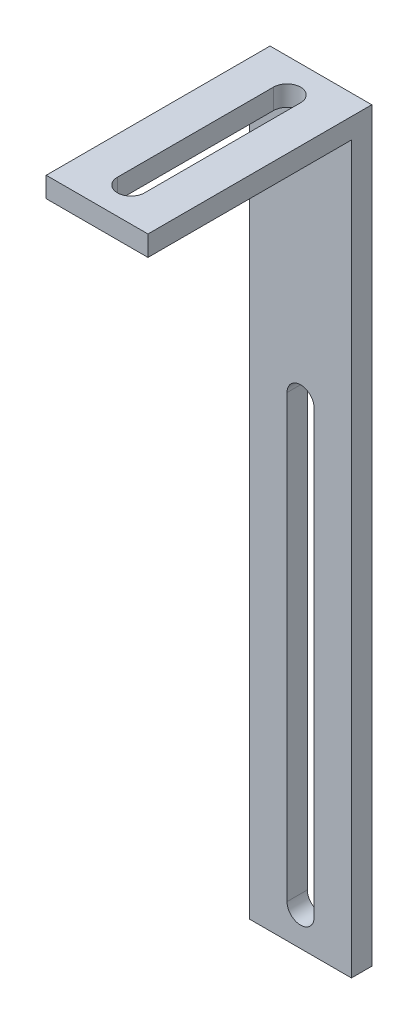
ISO-10303-21;
HEADER;
FILE_DESCRIPTION(('STEP AP214'),'2;1');
FILE_NAME('part.step','',(''),(''),'','','');
FILE_SCHEMA(('AUTOMOTIVE_DESIGN { 1 0 10303 214 1 1 1 1 }'));
ENDSEC;
DATA;
#1=APPLICATION_CONTEXT('core data for automotive mechanical design processes');
#2=APPLICATION_PROTOCOL_DEFINITION('international standard','automotive_design',2000,#1);
#3=PRODUCT_CONTEXT('',#1,'mechanical');
#4=PRODUCT('Part','Part','',(#3));
#5=PRODUCT_RELATED_PRODUCT_CATEGORY('part','',(#4));
#6=PRODUCT_DEFINITION_FORMATION('','',#4);
#7=PRODUCT_DEFINITION_CONTEXT('part definition',#1,'design');
#8=PRODUCT_DEFINITION('design','',#6,#7);
#9=PRODUCT_DEFINITION_SHAPE('','',#8);
#10=(LENGTH_UNIT() NAMED_UNIT(*) SI_UNIT(.MILLI.,.METRE.));
#11=(NAMED_UNIT(*) PLANE_ANGLE_UNIT() SI_UNIT($,.RADIAN.));
#12=(NAMED_UNIT(*) SI_UNIT($,.STERADIAN.) SOLID_ANGLE_UNIT());
#13=UNCERTAINTY_MEASURE_WITH_UNIT(LENGTH_MEASURE(1.E-05),#10,'distance_accuracy_value','');
#14=(GEOMETRIC_REPRESENTATION_CONTEXT(3) GLOBAL_UNCERTAINTY_ASSIGNED_CONTEXT((#13)) GLOBAL_UNIT_ASSIGNED_CONTEXT((#10,
#11,#12)) REPRESENTATION_CONTEXT('',''));
#15=CARTESIAN_POINT('',(0.,0.,0.));
#16=DIRECTION('',(0.,0.,1.));
#17=DIRECTION('',(1.,0.,0.));
#18=AXIS2_PLACEMENT_3D('',#15,#16,#17);
#19=CARTESIAN_POINT('',(7.49999999999999,55.,3.));
#20=DIRECTION('',(-1.,0.,0.));
#21=DIRECTION('',(0.,-1.,0.));
#22=AXIS2_PLACEMENT_3D('',#19,#20,#21);
#23=PLANE('',#22);
#24=DIRECTION('',(0.,1.,0.));
#25=VECTOR('',#24,1.);
#26=CARTESIAN_POINT('',(7.49999999999999,55.,0.));
#27=LINE('',#26,#25);
#28=CARTESIAN_POINT('',(7.50000000000001,-55.,0.));
#29=VERTEX_POINT('',#28);
#30=CARTESIAN_POINT('',(7.49999999999999,55.,0.));
#31=VERTEX_POINT('',#30);
#32=EDGE_CURVE('E212',#29,#31,#27,.T.);
#33=ORIENTED_EDGE('',*,*,#32,.T.);
#34=DIRECTION('',(0.,0.,-1.));
#35=VECTOR('',#34,1.);
#36=CARTESIAN_POINT('',(7.49999999999999,55.,3.));
#37=LINE('',#36,#35);
#38=CARTESIAN_POINT('',(7.50000000000001,55.,33.));
#39=VERTEX_POINT('',#38);
#40=EDGE_CURVE('E243',#39,#31,#37,.T.);
#41=ORIENTED_EDGE('',*,*,#40,.F.);
#42=DIRECTION('',(0.,1.,0.));
#43=VECTOR('',#42,1.);
#44=CARTESIAN_POINT('',(7.50000000000001,55.,33.));
#45=LINE('',#44,#43);
#46=CARTESIAN_POINT('',(7.50000000000001,52.,33.));
#47=VERTEX_POINT('',#46);
#48=EDGE_CURVE('E172',#47,#39,#45,.T.);
#49=ORIENTED_EDGE('',*,*,#48,.F.);
#50=DIRECTION('',(0.,0.,-1.));
#51=VECTOR('',#50,1.);
#52=CARTESIAN_POINT('',(7.50000000000001,52.,33.));
#53=LINE('',#52,#51);
#54=CARTESIAN_POINT('',(7.50000000000001,52.,3.));
#55=VERTEX_POINT('',#54);
#56=EDGE_CURVE('E178',#47,#55,#53,.T.);
#57=ORIENTED_EDGE('',*,*,#56,.T.);
#58=DIRECTION('',(0.,1.,0.));
#59=VECTOR('',#58,1.);
#60=CARTESIAN_POINT('',(7.49999999999999,55.,3.));
#61=LINE('',#60,#59);
#62=CARTESIAN_POINT('',(7.50000000000001,-55.,3.));
#63=VERTEX_POINT('',#62);
#64=EDGE_CURVE('E219',#63,#55,#61,.T.);
#65=ORIENTED_EDGE('',*,*,#64,.F.);
#66=DIRECTION('',(0.,0.,-1.));
#67=VECTOR('',#66,1.);
#68=CARTESIAN_POINT('',(7.50000000000001,-55.,3.));
#69=LINE('',#68,#67);
#70=EDGE_CURVE('E227',#63,#29,#69,.T.);
#71=ORIENTED_EDGE('',*,*,#70,.T.);
#72=EDGE_LOOP('',(#33,#41,#49,#57,#65,#71));
#73=FACE_BOUND('',#72,.T.);
#74=ADVANCED_FACE('F34',(#73),#23,.F.);
#75=CARTESIAN_POINT('',(-7.50000000000001,55.,3.));
#76=DIRECTION('',(0.,-1.,0.));
#77=DIRECTION('',(0.,0.,-1.));
#78=AXIS2_PLACEMENT_3D('',#75,#76,#77);
#79=PLANE('',#78);
#80=DIRECTION('',(0.,0.,1.));
#81=VECTOR('',#80,1.);
#82=CARTESIAN_POINT('',(-2.00000000000001,55.,5.));
#83=LINE('',#82,#81);
#84=CARTESIAN_POINT('',(-2.00000000000001,55.,5.));
#85=VERTEX_POINT('',#84);
#86=CARTESIAN_POINT('',(-2.,55.,28.));
#87=VERTEX_POINT('',#86);
#88=EDGE_CURVE('E149',#85,#87,#83,.T.);
#89=ORIENTED_EDGE('',*,*,#88,.F.);
#90=CARTESIAN_POINT('',(0.,55.,5.));
#91=DIRECTION('',(0.,1.,0.));
#92=DIRECTION('',(0.,0.,1.));
#93=AXIS2_PLACEMENT_3D('',#90,#91,#92);
#94=CIRCLE('',#93,2.);
#95=CARTESIAN_POINT('',(1.99999999999999,55.,5.));
#96=VERTEX_POINT('',#95);
#97=EDGE_CURVE('E48',#96,#85,#94,.T.);
#98=ORIENTED_EDGE('',*,*,#97,.F.);
#99=DIRECTION('',(0.,0.,-1.));
#100=VECTOR('',#99,1.);
#101=CARTESIAN_POINT('',(1.99999999999999,55.,5.));
#102=LINE('',#101,#100);
#103=CARTESIAN_POINT('',(2.,55.,28.));
#104=VERTEX_POINT('',#103);
#105=EDGE_CURVE('E156',#104,#96,#102,.T.);
#106=ORIENTED_EDGE('',*,*,#105,.F.);
#107=CARTESIAN_POINT('',(0.,55.,28.));
#108=DIRECTION('',(0.,1.,0.));
#109=DIRECTION('',(0.,0.,1.));
#110=AXIS2_PLACEMENT_3D('',#107,#108,#109);
#111=CIRCLE('',#110,2.);
#112=EDGE_CURVE('E140',#87,#104,#111,.T.);
#113=ORIENTED_EDGE('',*,*,#112,.F.);
#114=EDGE_LOOP('',(#89,#98,#106,#113));
#115=FACE_BOUND('',#114,.T.);
#116=DIRECTION('',(-1.,0.,0.));
#117=VECTOR('',#116,1.);
#118=CARTESIAN_POINT('',(-7.50000000000001,55.,0.));
#119=LINE('',#118,#117);
#120=CARTESIAN_POINT('',(-7.50000000000001,55.,0.));
#121=VERTEX_POINT('',#120);
#122=EDGE_CURVE('E230',#31,#121,#119,.T.);
#123=ORIENTED_EDGE('',*,*,#122,.T.);
#124=DIRECTION('',(0.,0.,-1.));
#125=VECTOR('',#124,1.);
#126=CARTESIAN_POINT('',(-7.50000000000001,55.,3.));
#127=LINE('',#126,#125);
#128=CARTESIAN_POINT('',(-7.50000000000001,55.,33.));
#129=VERTEX_POINT('',#128);
#130=EDGE_CURVE('E240',#129,#121,#127,.T.);
#131=ORIENTED_EDGE('',*,*,#130,.F.);
#132=DIRECTION('',(-1.,0.,0.));
#133=VECTOR('',#132,1.);
#134=CARTESIAN_POINT('',(-7.50000000000001,55.,33.));
#135=LINE('',#134,#133);
#136=EDGE_CURVE('E175',#39,#129,#135,.T.);
#137=ORIENTED_EDGE('',*,*,#136,.F.);
#138=ORIENTED_EDGE('',*,*,#40,.T.);
#139=EDGE_LOOP('',(#123,#131,#137,#138));
#140=FACE_BOUND('',#139,.T.);
#141=ADVANCED_FACE('F153',(#115,#140),#79,.F.);
#142=CARTESIAN_POINT('',(-7.50000000000001,55.,3.));
#143=DIRECTION('',(1.,0.,0.));
#144=DIRECTION('',(0.,1.,0.));
#145=AXIS2_PLACEMENT_3D('',#142,#143,#144);
#146=PLANE('',#145);
#147=DIRECTION('',(0.,-1.,0.));
#148=VECTOR('',#147,1.);
#149=CARTESIAN_POINT('',(-7.50000000000001,55.,0.));
#150=LINE('',#149,#148);
#151=CARTESIAN_POINT('',(-7.49999999999999,-55.,0.));
#152=VERTEX_POINT('',#151);
#153=EDGE_CURVE('E232',#121,#152,#150,.T.);
#154=ORIENTED_EDGE('',*,*,#153,.T.);
#155=DIRECTION('',(0.,0.,-1.));
#156=VECTOR('',#155,1.);
#157=CARTESIAN_POINT('',(-7.49999999999999,-55.,3.));
#158=LINE('',#157,#156);
#159=CARTESIAN_POINT('',(-7.49999999999999,-55.,3.));
#160=VERTEX_POINT('',#159);
#161=EDGE_CURVE('E237',#160,#152,#158,.T.);
#162=ORIENTED_EDGE('',*,*,#161,.F.);
#163=DIRECTION('',(0.,-1.,0.));
#164=VECTOR('',#163,1.);
#165=CARTESIAN_POINT('',(-7.50000000000001,55.,3.));
#166=LINE('',#165,#164);
#167=CARTESIAN_POINT('',(-7.50000000000001,52.,3.));
#168=VERTEX_POINT('',#167);
#169=EDGE_CURVE('E222',#168,#160,#166,.T.);
#170=ORIENTED_EDGE('',*,*,#169,.F.);
#171=DIRECTION('',(0.,0.,-1.));
#172=VECTOR('',#171,1.);
#173=CARTESIAN_POINT('',(-7.50000000000001,52.,33.));
#174=LINE('',#173,#172);
#175=CARTESIAN_POINT('',(-7.50000000000001,52.,33.));
#176=VERTEX_POINT('',#175);
#177=EDGE_CURVE('E183',#176,#168,#174,.T.);
#178=ORIENTED_EDGE('',*,*,#177,.F.);
#179=DIRECTION('',(0.,-1.,0.));
#180=VECTOR('',#179,1.);
#181=CARTESIAN_POINT('',(-7.50000000000001,55.,33.));
#182=LINE('',#181,#180);
#183=EDGE_CURVE('E166',#129,#176,#182,.T.);
#184=ORIENTED_EDGE('',*,*,#183,.F.);
#185=ORIENTED_EDGE('',*,*,#130,.T.);
#186=EDGE_LOOP('',(#154,#162,#170,#178,#184,#185));
#187=FACE_BOUND('',#186,.T.);
#188=ADVANCED_FACE('F272',(#187),#146,.F.);
#189=CARTESIAN_POINT('',(-7.49999999999999,-55.,3.));
#190=DIRECTION('',(0.,1.,0.));
#191=DIRECTION('',(0.,0.,1.));
#192=AXIS2_PLACEMENT_3D('',#189,#190,#191);
#193=PLANE('',#192);
#194=DIRECTION('',(1.,0.,0.));
#195=VECTOR('',#194,1.);
#196=CARTESIAN_POINT('',(-7.49999999999999,-55.,0.));
#197=LINE('',#196,#195);
#198=EDGE_CURVE('E223',#152,#29,#197,.T.);
#199=ORIENTED_EDGE('',*,*,#198,.T.);
#200=ORIENTED_EDGE('',*,*,#70,.F.);
#201=DIRECTION('',(1.,0.,0.));
#202=VECTOR('',#201,1.);
#203=CARTESIAN_POINT('',(-7.49999999999999,-55.,3.));
#204=LINE('',#203,#202);
#205=EDGE_CURVE('E225',#160,#63,#204,.T.);
#206=ORIENTED_EDGE('',*,*,#205,.F.);
#207=ORIENTED_EDGE('',*,*,#161,.T.);
#208=EDGE_LOOP('',(#199,#200,#206,#207));
#209=FACE_BOUND('',#208,.T.);
#210=ADVANCED_FACE('F277',(#209),#193,.F.);
#211=CARTESIAN_POINT('',(0.,0.,3.));
#212=DIRECTION('',(0.,0.,1.));
#213=DIRECTION('',(1.,0.,0.));
#214=AXIS2_PLACEMENT_3D('',#211,#212,#213);
#215=PLANE('',#214);
#216=DIRECTION('',(1.,0.,0.));
#217=VECTOR('',#216,1.);
#218=CARTESIAN_POINT('',(-7.50000000000001,52.,3.));
#219=LINE('',#218,#217);
#220=CARTESIAN_POINT('',(0.,52.,3.));
#221=VERTEX_POINT('',#220);
#222=EDGE_CURVE('E163',#221,#55,#219,.T.);
#223=ORIENTED_EDGE('',*,*,#222,.F.);
#224=EDGE_CURVE('E170',#168,#221,#219,.T.);
#225=ORIENTED_EDGE('',*,*,#224,.F.);
#226=ORIENTED_EDGE('',*,*,#169,.T.);
#227=ORIENTED_EDGE('',*,*,#205,.T.);
#228=ORIENTED_EDGE('',*,*,#64,.T.);
#229=EDGE_LOOP('',(#223,#225,#226,#227,#228));
#230=FACE_BOUND('',#229,.T.);
#231=CARTESIAN_POINT('',(0.,15.,3.));
#232=DIRECTION('',(0.,0.,1.));
#233=DIRECTION('',(1.,0.,0.));
#234=AXIS2_PLACEMENT_3D('',#231,#232,#233);
#235=CIRCLE('',#234,2.);
#236=CARTESIAN_POINT('',(2.,15.,3.));
#237=VERTEX_POINT('',#236);
#238=CARTESIAN_POINT('',(-2.,15.,3.));
#239=VERTEX_POINT('',#238);
#240=EDGE_CURVE('E186',#237,#239,#235,.T.);
#241=ORIENTED_EDGE('',*,*,#240,.F.);
#242=DIRECTION('',(0.,1.,0.));
#243=VECTOR('',#242,1.);
#244=CARTESIAN_POINT('',(2.,15.,3.));
#245=LINE('',#244,#243);
#246=CARTESIAN_POINT('',(2.00000000000001,-50.,3.));
#247=VERTEX_POINT('',#246);
#248=EDGE_CURVE('E191',#247,#237,#245,.T.);
#249=ORIENTED_EDGE('',*,*,#248,.F.);
#250=CARTESIAN_POINT('',(0.,-50.,3.));
#251=DIRECTION('',(0.,0.,1.));
#252=DIRECTION('',(1.,0.,0.));
#253=AXIS2_PLACEMENT_3D('',#250,#251,#252);
#254=CIRCLE('',#253,2.);
#255=CARTESIAN_POINT('',(-1.99999999999999,-50.,3.));
#256=VERTEX_POINT('',#255);
#257=EDGE_CURVE('E205',#256,#247,#254,.T.);
#258=ORIENTED_EDGE('',*,*,#257,.F.);
#259=DIRECTION('',(0.,-1.,0.));
#260=VECTOR('',#259,1.);
#261=CARTESIAN_POINT('',(-2.,15.,3.));
#262=LINE('',#261,#260);
#263=EDGE_CURVE('E202',#239,#256,#262,.T.);
#264=ORIENTED_EDGE('',*,*,#263,.F.);
#265=EDGE_LOOP('',(#241,#249,#258,#264));
#266=FACE_BOUND('',#265,.T.);
#267=ADVANCED_FACE('F258',(#230,#266),#215,.T.);
#268=CARTESIAN_POINT('',(0.,0.,0.));
#269=DIRECTION('',(0.,0.,1.));
#270=DIRECTION('',(1.,0.,0.));
#271=AXIS2_PLACEMENT_3D('',#268,#269,#270);
#272=PLANE('',#271);
#273=DIRECTION('',(0.,1.,0.));
#274=VECTOR('',#273,1.);
#275=CARTESIAN_POINT('',(2.,15.,0.));
#276=LINE('',#275,#274);
#277=CARTESIAN_POINT('',(2.00000000000001,-50.,0.));
#278=VERTEX_POINT('',#277);
#279=CARTESIAN_POINT('',(2.,15.,0.));
#280=VERTEX_POINT('',#279);
#281=EDGE_CURVE('E197',#278,#280,#276,.T.);
#282=ORIENTED_EDGE('',*,*,#281,.T.);
#283=CARTESIAN_POINT('',(0.,15.,0.));
#284=DIRECTION('',(0.,0.,1.));
#285=DIRECTION('',(1.,0.,0.));
#286=AXIS2_PLACEMENT_3D('',#283,#284,#285);
#287=CIRCLE('',#286,2.);
#288=CARTESIAN_POINT('',(-2.,15.,0.));
#289=VERTEX_POINT('',#288);
#290=EDGE_CURVE('E187',#280,#289,#287,.T.);
#291=ORIENTED_EDGE('',*,*,#290,.T.);
#292=DIRECTION('',(0.,-1.,0.));
#293=VECTOR('',#292,1.);
#294=CARTESIAN_POINT('',(-2.,15.,0.));
#295=LINE('',#294,#293);
#296=CARTESIAN_POINT('',(-1.99999999999999,-50.,0.));
#297=VERTEX_POINT('',#296);
#298=EDGE_CURVE('E190',#289,#297,#295,.T.);
#299=ORIENTED_EDGE('',*,*,#298,.T.);
#300=CARTESIAN_POINT('',(0.,-50.,0.));
#301=DIRECTION('',(0.,0.,1.));
#302=DIRECTION('',(1.,0.,0.));
#303=AXIS2_PLACEMENT_3D('',#300,#301,#302);
#304=CIRCLE('',#303,2.);
#305=EDGE_CURVE('E194',#297,#278,#304,.T.);
#306=ORIENTED_EDGE('',*,*,#305,.T.);
#307=EDGE_LOOP('',(#282,#291,#299,#306));
#308=FACE_BOUND('',#307,.T.);
#309=ORIENTED_EDGE('',*,*,#32,.F.);
#310=ORIENTED_EDGE('',*,*,#198,.F.);
#311=ORIENTED_EDGE('',*,*,#153,.F.);
#312=ORIENTED_EDGE('',*,*,#122,.F.);
#313=EDGE_LOOP('',(#309,#310,#311,#312));
#314=FACE_BOUND('',#313,.T.);
#315=ADVANCED_FACE('F280',(#308,#314),#272,.F.);
#316=CARTESIAN_POINT('',(0.,15.,0.));
#317=DIRECTION('',(0.,0.,1.));
#318=DIRECTION('',(1.,0.,0.));
#319=AXIS2_PLACEMENT_3D('',#316,#317,#318);
#320=CYLINDRICAL_SURFACE('',#319,2.);
#321=ORIENTED_EDGE('',*,*,#240,.T.);
#322=DIRECTION('',(0.,0.,1.));
#323=VECTOR('',#322,1.);
#324=CARTESIAN_POINT('',(-2.,15.,0.));
#325=LINE('',#324,#323);
#326=EDGE_CURVE('E200',#289,#239,#325,.T.);
#327=ORIENTED_EDGE('',*,*,#326,.F.);
#328=ORIENTED_EDGE('',*,*,#290,.F.);
#329=DIRECTION('',(0.,0.,1.));
#330=VECTOR('',#329,1.);
#331=CARTESIAN_POINT('',(2.,15.,0.));
#332=LINE('',#331,#330);
#333=EDGE_CURVE('E210',#280,#237,#332,.T.);
#334=ORIENTED_EDGE('',*,*,#333,.T.);
#335=EDGE_LOOP('',(#321,#327,#328,#334));
#336=FACE_BOUND('',#335,.T.);
#337=ADVANCED_FACE('F292',(#336),#320,.F.);
#338=CARTESIAN_POINT('',(2.,15.,0.));
#339=DIRECTION('',(1.,0.,0.));
#340=DIRECTION('',(0.,1.,0.));
#341=AXIS2_PLACEMENT_3D('',#338,#339,#340);
#342=PLANE('',#341);
#343=ORIENTED_EDGE('',*,*,#248,.T.);
#344=ORIENTED_EDGE('',*,*,#333,.F.);
#345=ORIENTED_EDGE('',*,*,#281,.F.);
#346=DIRECTION('',(0.,0.,1.));
#347=VECTOR('',#346,1.);
#348=CARTESIAN_POINT('',(2.00000000000001,-50.,0.));
#349=LINE('',#348,#347);
#350=EDGE_CURVE('E213',#278,#247,#349,.T.);
#351=ORIENTED_EDGE('',*,*,#350,.T.);
#352=EDGE_LOOP('',(#343,#344,#345,#351));
#353=FACE_BOUND('',#352,.T.);
#354=ADVANCED_FACE('F298',(#353),#342,.F.);
#355=CARTESIAN_POINT('',(0.,-50.,0.));
#356=DIRECTION('',(0.,0.,1.));
#357=DIRECTION('',(1.,0.,0.));
#358=AXIS2_PLACEMENT_3D('',#355,#356,#357);
#359=CYLINDRICAL_SURFACE('',#358,2.);
#360=ORIENTED_EDGE('',*,*,#257,.T.);
#361=ORIENTED_EDGE('',*,*,#350,.F.);
#362=ORIENTED_EDGE('',*,*,#305,.F.);
#363=DIRECTION('',(0.,0.,1.));
#364=VECTOR('',#363,1.);
#365=CARTESIAN_POINT('',(-1.99999999999999,-50.,0.));
#366=LINE('',#365,#364);
#367=EDGE_CURVE('E215',#297,#256,#366,.T.);
#368=ORIENTED_EDGE('',*,*,#367,.T.);
#369=EDGE_LOOP('',(#360,#361,#362,#368));
#370=FACE_BOUND('',#369,.T.);
#371=ADVANCED_FACE('F303',(#370),#359,.F.);
#372=CARTESIAN_POINT('',(-2.,15.,0.));
#373=DIRECTION('',(-1.,0.,0.));
#374=DIRECTION('',(0.,-1.,0.));
#375=AXIS2_PLACEMENT_3D('',#372,#373,#374);
#376=PLANE('',#375);
#377=ORIENTED_EDGE('',*,*,#263,.T.);
#378=ORIENTED_EDGE('',*,*,#367,.F.);
#379=ORIENTED_EDGE('',*,*,#298,.F.);
#380=ORIENTED_EDGE('',*,*,#326,.T.);
#381=EDGE_LOOP('',(#377,#378,#379,#380));
#382=FACE_BOUND('',#381,.T.);
#383=ADVANCED_FACE('F300',(#382),#376,.F.);
#384=CARTESIAN_POINT('',(-7.50000000000001,52.,33.));
#385=DIRECTION('',(0.,1.,0.));
#386=DIRECTION('',(0.,0.,1.));
#387=AXIS2_PLACEMENT_3D('',#384,#385,#386);
#388=PLANE('',#387);
#389=DIRECTION('',(0.,0.,-1.));
#390=VECTOR('',#389,1.);
#391=CARTESIAN_POINT('',(2.,52.,33.));
#392=LINE('',#391,#390);
#393=CARTESIAN_POINT('',(2.,52.,28.));
#394=VERTEX_POINT('',#393);
#395=CARTESIAN_POINT('',(1.99999999999999,52.,5.));
#396=VERTEX_POINT('',#395);
#397=EDGE_CURVE('E248',#394,#396,#392,.T.);
#398=ORIENTED_EDGE('',*,*,#397,.T.);
#399=CARTESIAN_POINT('',(0.,52.,5.));
#400=DIRECTION('',(0.,1.,0.));
#401=DIRECTION('',(0.,0.,1.));
#402=AXIS2_PLACEMENT_3D('',#399,#400,#401);
#403=CIRCLE('',#402,2.);
#404=EDGE_CURVE('E11',#396,#221,#403,.T.);
#405=ORIENTED_EDGE('',*,*,#404,.T.);
#406=ORIENTED_EDGE('',*,*,#222,.T.);
#407=ORIENTED_EDGE('',*,*,#56,.F.);
#408=DIRECTION('',(1.,0.,0.));
#409=VECTOR('',#408,1.);
#410=CARTESIAN_POINT('',(-7.50000000000001,52.,33.));
#411=LINE('',#410,#409);
#412=EDGE_CURVE('E169',#176,#47,#411,.T.);
#413=ORIENTED_EDGE('',*,*,#412,.F.);
#414=ORIENTED_EDGE('',*,*,#177,.T.);
#415=ORIENTED_EDGE('',*,*,#224,.T.);
#416=CARTESIAN_POINT('',(-2.00000000000001,52.,5.));
#417=VERTEX_POINT('',#416);
#418=EDGE_CURVE('E37',#221,#417,#403,.T.);
#419=ORIENTED_EDGE('',*,*,#418,.T.);
#420=DIRECTION('',(0.,0.,1.));
#421=VECTOR('',#420,1.);
#422=CARTESIAN_POINT('',(-2.,52.,33.));
#423=LINE('',#422,#421);
#424=CARTESIAN_POINT('',(-2.,52.,28.));
#425=VERTEX_POINT('',#424);
#426=EDGE_CURVE('E246',#417,#425,#423,.T.);
#427=ORIENTED_EDGE('',*,*,#426,.T.);
#428=CARTESIAN_POINT('',(0.,52.,28.));
#429=DIRECTION('',(0.,1.,0.));
#430=DIRECTION('',(0.,0.,1.));
#431=AXIS2_PLACEMENT_3D('',#428,#429,#430);
#432=CIRCLE('',#431,2.);
#433=EDGE_CURVE('E143',#425,#394,#432,.T.);
#434=ORIENTED_EDGE('',*,*,#433,.T.);
#435=EDGE_LOOP('',(#398,#405,#406,#407,#413,#414,#415,#419,#427,#434));
#436=FACE_BOUND('',#435,.T.);
#437=ADVANCED_FACE('F252',(#436),#388,.F.);
#438=CARTESIAN_POINT('',(0.,0.,33.));
#439=DIRECTION('',(0.,0.,1.));
#440=DIRECTION('',(1.,0.,0.));
#441=AXIS2_PLACEMENT_3D('',#438,#439,#440);
#442=PLANE('',#441);
#443=ORIENTED_EDGE('',*,*,#183,.T.);
#444=ORIENTED_EDGE('',*,*,#412,.T.);
#445=ORIENTED_EDGE('',*,*,#48,.T.);
#446=ORIENTED_EDGE('',*,*,#136,.T.);
#447=EDGE_LOOP('',(#443,#444,#445,#446));
#448=FACE_BOUND('',#447,.T.);
#449=ADVANCED_FACE('F269',(#448),#442,.T.);
#450=CARTESIAN_POINT('',(0.,25.,5.));
#451=DIRECTION('',(0.,1.,0.));
#452=DIRECTION('',(0.,0.,1.));
#453=AXIS2_PLACEMENT_3D('',#450,#451,#452);
#454=CYLINDRICAL_SURFACE('',#453,2.);
#455=DIRECTION('',(0.,1.,0.));
#456=VECTOR('',#455,1.);
#457=CARTESIAN_POINT('',(1.99999999999999,25.,5.));
#458=LINE('',#457,#456);
#459=EDGE_CURVE('E161',#396,#96,#458,.T.);
#460=ORIENTED_EDGE('',*,*,#459,.T.);
#461=ORIENTED_EDGE('',*,*,#97,.T.);
#462=DIRECTION('',(0.,1.,0.));
#463=VECTOR('',#462,1.);
#464=CARTESIAN_POINT('',(-2.00000000000001,25.,5.));
#465=LINE('',#464,#463);
#466=EDGE_CURVE('E146',#417,#85,#465,.T.);
#467=ORIENTED_EDGE('',*,*,#466,.F.);
#468=ORIENTED_EDGE('',*,*,#418,.F.);
#469=ORIENTED_EDGE('',*,*,#404,.F.);
#470=EDGE_LOOP('',(#460,#461,#467,#468,#469));
#471=FACE_BOUND('',#470,.T.);
#472=ADVANCED_FACE('F253',(#471),#454,.F.);
#473=CARTESIAN_POINT('',(1.99999999999999,25.,5.));
#474=DIRECTION('',(1.,0.,0.));
#475=DIRECTION('',(0.,0.,-1.));
#476=AXIS2_PLACEMENT_3D('',#473,#474,#475);
#477=PLANE('',#476);
#478=DIRECTION('',(0.,1.,0.));
#479=VECTOR('',#478,1.);
#480=CARTESIAN_POINT('',(2.,25.,28.));
#481=LINE('',#480,#479);
#482=EDGE_CURVE('E145',#394,#104,#481,.T.);
#483=ORIENTED_EDGE('',*,*,#482,.T.);
#484=ORIENTED_EDGE('',*,*,#105,.T.);
#485=ORIENTED_EDGE('',*,*,#459,.F.);
#486=ORIENTED_EDGE('',*,*,#397,.F.);
#487=EDGE_LOOP('',(#483,#484,#485,#486));
#488=FACE_BOUND('',#487,.T.);
#489=ADVANCED_FACE('F317',(#488),#477,.F.);
#490=CARTESIAN_POINT('',(0.,25.,28.));
#491=DIRECTION('',(0.,1.,0.));
#492=DIRECTION('',(0.,0.,1.));
#493=AXIS2_PLACEMENT_3D('',#490,#491,#492);
#494=CYLINDRICAL_SURFACE('',#493,2.);
#495=DIRECTION('',(0.,1.,0.));
#496=VECTOR('',#495,1.);
#497=CARTESIAN_POINT('',(-2.,25.,28.));
#498=LINE('',#497,#496);
#499=EDGE_CURVE('E56',#425,#87,#498,.T.);
#500=ORIENTED_EDGE('',*,*,#499,.T.);
#501=ORIENTED_EDGE('',*,*,#112,.T.);
#502=ORIENTED_EDGE('',*,*,#482,.F.);
#503=ORIENTED_EDGE('',*,*,#433,.F.);
#504=EDGE_LOOP('',(#500,#501,#502,#503));
#505=FACE_BOUND('',#504,.T.);
#506=ADVANCED_FACE('F137',(#505),#494,.F.);
#507=CARTESIAN_POINT('',(-2.00000000000001,25.,5.));
#508=DIRECTION('',(-1.,0.,0.));
#509=DIRECTION('',(0.,0.,1.));
#510=AXIS2_PLACEMENT_3D('',#507,#508,#509);
#511=PLANE('',#510);
#512=ORIENTED_EDGE('',*,*,#466,.T.);
#513=ORIENTED_EDGE('',*,*,#88,.T.);
#514=ORIENTED_EDGE('',*,*,#499,.F.);
#515=ORIENTED_EDGE('',*,*,#426,.F.);
#516=EDGE_LOOP('',(#512,#513,#514,#515));
#517=FACE_BOUND('',#516,.T.);
#518=ADVANCED_FACE('F150',(#517),#511,.F.);
#519=CLOSED_SHELL('',(#74,#141,#188,#210,#267,#315,#337,#354,#371,#383,#437,#449,#472,#489,#506,#518));
#520=MANIFOLD_SOLID_BREP('B2',#519);
#521=ADVANCED_BREP_SHAPE_REPRESENTATION('',(#18,#520),#14);
#522=SHAPE_DEFINITION_REPRESENTATION(#9,#521);
ENDSEC;
END-ISO-10303-21;
